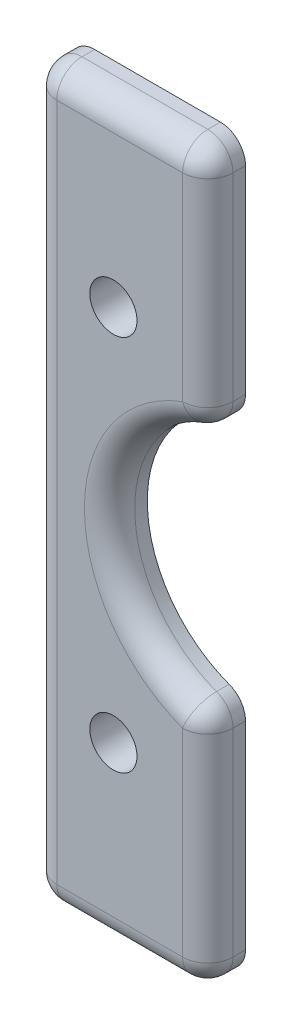
ISO-10303-21;
HEADER;
FILE_DESCRIPTION(('STEP AP214'),'2;1');
FILE_NAME('part.step','',(''),(''),'','','');
FILE_SCHEMA(('AUTOMOTIVE_DESIGN { 1 0 10303 214 1 1 1 1 }'));
ENDSEC;
DATA;
#1=APPLICATION_CONTEXT('core data for automotive mechanical design processes');
#2=APPLICATION_PROTOCOL_DEFINITION('international standard','automotive_design',2000,#1);
#3=PRODUCT_CONTEXT('',#1,'mechanical');
#4=PRODUCT('Part','Part','',(#3));
#5=PRODUCT_RELATED_PRODUCT_CATEGORY('part','',(#4));
#6=PRODUCT_DEFINITION_FORMATION('','',#4);
#7=PRODUCT_DEFINITION_CONTEXT('part definition',#1,'design');
#8=PRODUCT_DEFINITION('design','',#6,#7);
#9=PRODUCT_DEFINITION_SHAPE('','',#8);
#10=(LENGTH_UNIT() NAMED_UNIT(*) SI_UNIT(.MILLI.,.METRE.));
#11=(NAMED_UNIT(*) PLANE_ANGLE_UNIT() SI_UNIT($,.RADIAN.));
#12=(NAMED_UNIT(*) SI_UNIT($,.STERADIAN.) SOLID_ANGLE_UNIT());
#13=UNCERTAINTY_MEASURE_WITH_UNIT(LENGTH_MEASURE(1.E-05),#10,'distance_accuracy_value','');
#14=(GEOMETRIC_REPRESENTATION_CONTEXT(3) GLOBAL_UNCERTAINTY_ASSIGNED_CONTEXT((#13)) GLOBAL_UNIT_ASSIGNED_CONTEXT((#10,
#11,#12)) REPRESENTATION_CONTEXT('',''));
#15=CARTESIAN_POINT('',(0.,0.,0.));
#16=DIRECTION('',(0.,0.,1.));
#17=DIRECTION('',(1.,0.,0.));
#18=AXIS2_PLACEMENT_3D('',#15,#16,#17);
#19=CARTESIAN_POINT('',(-20.9977276506516,-57.0134412764199,3.));
#20=DIRECTION('',(0.,0.,1.));
#21=DIRECTION('',(1.,0.,0.));
#22=AXIS2_PLACEMENT_3D('',#19,#20,#21);
#23=PLANE('',#22);
#24=DIRECTION('',(0.,1.,0.));
#25=VECTOR('',#24,1.);
#26=CARTESIAN_POINT('',(-20.9977276506516,-41.2519748615297,3.));
#27=LINE('',#26,#25);
#28=CARTESIAN_POINT('',(-20.9977276506516,-57.0134412764199,3.));
#29=VERTEX_POINT('',#28);
#30=CARTESIAN_POINT('',(-20.9977276506516,-41.2519748615297,3.));
#31=VERTEX_POINT('',#30);
#32=EDGE_CURVE('E233',#29,#31,#27,.T.);
#33=ORIENTED_EDGE('',*,*,#32,.T.);
#34=CARTESIAN_POINT('',(-16.8042111934991,-30.0085581333471,3.));
#35=DIRECTION('',(0.,0.,1.));
#36=DIRECTION('',(1.,0.,0.));
#37=AXIS2_PLACEMENT_3D('',#34,#35,#36);
#38=CIRCLE('',#37,11.9999999999995);
#39=CARTESIAN_POINT('',(-20.9977276506516,-18.7651414051644,3.));
#40=VERTEX_POINT('',#39);
#41=EDGE_CURVE('E235',#31,#40,#38,.F.);
#42=ORIENTED_EDGE('',*,*,#41,.T.);
#43=DIRECTION('',(0.,1.,0.));
#44=VECTOR('',#43,1.);
#45=CARTESIAN_POINT('',(-20.9977276506516,-3.01344127641991,3.));
#46=LINE('',#45,#44);
#47=CARTESIAN_POINT('',(-20.9977276506516,-3.0134412764199,3.));
#48=VERTEX_POINT('',#47);
#49=EDGE_CURVE('E225',#40,#48,#46,.T.);
#50=ORIENTED_EDGE('',*,*,#49,.T.);
#51=DIRECTION('',(-1.,0.,0.));
#52=VECTOR('',#51,1.);
#53=CARTESIAN_POINT('',(-30.997581376349,-3.0134412764199,3.));
#54=LINE('',#53,#52);
#55=CARTESIAN_POINT('',(-30.997581376349,-3.0134412764199,3.));
#56=VERTEX_POINT('',#55);
#57=EDGE_CURVE('E227',#48,#56,#54,.T.);
#58=ORIENTED_EDGE('',*,*,#57,.T.);
#59=DIRECTION('',(0.,-1.,0.));
#60=VECTOR('',#59,1.);
#61=CARTESIAN_POINT('',(-30.997581376349,-57.0134412764199,3.));
#62=LINE('',#61,#60);
#63=CARTESIAN_POINT('',(-30.997581376349,-57.0134412764199,3.));
#64=VERTEX_POINT('',#63);
#65=EDGE_CURVE('E229',#56,#64,#62,.T.);
#66=ORIENTED_EDGE('',*,*,#65,.T.);
#67=DIRECTION('',(1.,0.,0.));
#68=VECTOR('',#67,1.);
#69=CARTESIAN_POINT('',(-20.9977276506516,-57.0134412764199,3.));
#70=LINE('',#69,#68);
#71=EDGE_CURVE('E231',#64,#29,#70,.T.);
#72=ORIENTED_EDGE('',*,*,#71,.T.);
#73=EDGE_LOOP('',(#33,#42,#50,#58,#66,#72));
#74=FACE_BOUND('',#73,.T.);
#75=CARTESIAN_POINT('',(-26.5018482558349,-15.0085587465849,3.));
#76=DIRECTION('',(0.,0.,1.));
#77=DIRECTION('',(1.,0.,0.));
#78=AXIS2_PLACEMENT_3D('',#75,#76,#77);
#79=CIRCLE('',#78,1.875);
#80=CARTESIAN_POINT('',(-24.6268482558349,-15.0085587465849,3.));
#81=VERTEX_POINT('',#80);
#82=EDGE_CURVE('E169',#81,#81,#79,.T.);
#83=ORIENTED_EDGE('',*,*,#82,.F.);
#84=EDGE_LOOP('',(#83));
#85=FACE_BOUND('',#84,.T.);
#86=CARTESIAN_POINT('',(-26.5018482558349,-45.0085587465849,3.));
#87=DIRECTION('',(0.,0.,1.));
#88=DIRECTION('',(1.,0.,0.));
#89=AXIS2_PLACEMENT_3D('',#86,#87,#88);
#90=CIRCLE('',#89,1.875);
#91=CARTESIAN_POINT('',(-24.6268482558349,-45.0085587465849,3.));
#92=VERTEX_POINT('',#91);
#93=EDGE_CURVE('E302',#92,#92,#90,.T.);
#94=ORIENTED_EDGE('',*,*,#93,.F.);
#95=EDGE_LOOP('',(#94));
#96=FACE_BOUND('',#95,.T.);
#97=ADVANCED_FACE('F33',(#74,#85,#96),#23,.T.);
#98=CARTESIAN_POINT('',(-20.9977276506516,-57.0134412764199,0.));
#99=DIRECTION('',(0.,0.,1.));
#100=DIRECTION('',(1.,0.,0.));
#101=AXIS2_PLACEMENT_3D('',#98,#99,#100);
#102=PLANE('',#101);
#103=CARTESIAN_POINT('',(-26.5018482557661,-52.5085587465851,0.));
#104=DIRECTION('',(0.,0.,1.));
#105=DIRECTION('',(1.,0.,0.));
#106=AXIS2_PLACEMENT_3D('',#103,#104,#105);
#107=CIRCLE('',#106,3.75000000000001);
#108=CARTESIAN_POINT('',(-22.7518482557661,-52.5085587465851,0.));
#109=VERTEX_POINT('',#108);
#110=EDGE_CURVE('E37',#109,#109,#107,.T.);
#111=ORIENTED_EDGE('',*,*,#110,.T.);
#112=EDGE_LOOP('',(#111));
#113=FACE_BOUND('',#112,.T.);
#114=CARTESIAN_POINT('',(-26.501848255766,-7.50855874658511,0.));
#115=DIRECTION('',(0.,0.,1.));
#116=DIRECTION('',(1.,0.,0.));
#117=AXIS2_PLACEMENT_3D('',#114,#115,#116);
#118=CIRCLE('',#117,3.75000000000001);
#119=CARTESIAN_POINT('',(-22.751848255766,-7.50855874658511,0.));
#120=VERTEX_POINT('',#119);
#121=EDGE_CURVE('E258',#120,#120,#118,.T.);
#122=ORIENTED_EDGE('',*,*,#121,.T.);
#123=EDGE_LOOP('',(#122));
#124=FACE_BOUND('',#123,.T.);
#125=CARTESIAN_POINT('',(-20.9977276506516,-57.0134412764199,0.));
#126=DIRECTION('',(0.,0.,1.));
#127=DIRECTION('',(1.,0.,0.));
#128=AXIS2_PLACEMENT_3D('',#125,#126,#127);
#129=CIRCLE('',#128,2.);
#130=CARTESIAN_POINT('',(-20.9977276506516,-59.0134412764199,0.));
#131=VERTEX_POINT('',#130);
#132=CARTESIAN_POINT('',(-18.9977276506516,-57.0134412764199,0.));
#133=VERTEX_POINT('',#132);
#134=EDGE_CURVE('E160',#131,#133,#129,.T.);
#135=ORIENTED_EDGE('',*,*,#134,.F.);
#136=DIRECTION('',(1.,0.,0.));
#137=VECTOR('',#136,1.);
#138=CARTESIAN_POINT('',(-20.9977276506516,-59.0134412764199,0.));
#139=LINE('',#138,#137);
#140=CARTESIAN_POINT('',(-30.997581376349,-59.0134412764199,0.));
#141=VERTEX_POINT('',#140);
#142=EDGE_CURVE('E201',#141,#131,#139,.T.);
#143=ORIENTED_EDGE('',*,*,#142,.F.);
#144=CARTESIAN_POINT('',(-30.997581376349,-57.0134412764199,0.));
#145=DIRECTION('',(0.,0.,1.));
#146=DIRECTION('',(-1.,0.,0.));
#147=AXIS2_PLACEMENT_3D('',#144,#145,#146);
#148=CIRCLE('',#147,2.);
#149=CARTESIAN_POINT('',(-32.997581376349,-57.0134412764199,0.));
#150=VERTEX_POINT('',#149);
#151=EDGE_CURVE('E198',#150,#141,#148,.T.);
#152=ORIENTED_EDGE('',*,*,#151,.F.);
#153=DIRECTION('',(0.,-1.,0.));
#154=VECTOR('',#153,1.);
#155=CARTESIAN_POINT('',(-32.997581376349,-3.01344127641992,0.));
#156=LINE('',#155,#154);
#157=CARTESIAN_POINT('',(-32.997581376349,-3.01344127641992,0.));
#158=VERTEX_POINT('',#157);
#159=EDGE_CURVE('E195',#158,#150,#156,.T.);
#160=ORIENTED_EDGE('',*,*,#159,.F.);
#161=CARTESIAN_POINT('',(-30.997581376349,-3.0134412764199,0.));
#162=DIRECTION('',(0.,0.,1.));
#163=DIRECTION('',(-1.,0.,0.));
#164=AXIS2_PLACEMENT_3D('',#161,#162,#163);
#165=CIRCLE('',#164,2.);
#166=CARTESIAN_POINT('',(-30.997581376349,-1.0134412764199,0.));
#167=VERTEX_POINT('',#166);
#168=EDGE_CURVE('E192',#167,#158,#165,.T.);
#169=ORIENTED_EDGE('',*,*,#168,.F.);
#170=DIRECTION('',(-1.,0.,0.));
#171=VECTOR('',#170,1.);
#172=CARTESIAN_POINT('',(-20.9977276506516,-1.0134412764199,0.));
#173=LINE('',#172,#171);
#174=CARTESIAN_POINT('',(-20.9977276506516,-1.0134412764199,0.));
#175=VERTEX_POINT('',#174);
#176=EDGE_CURVE('E189',#175,#167,#173,.T.);
#177=ORIENTED_EDGE('',*,*,#176,.F.);
#178=CARTESIAN_POINT('',(-20.9977276506516,-3.0134412764199,0.));
#179=DIRECTION('',(0.,0.,1.));
#180=DIRECTION('',(-1.,0.,0.));
#181=AXIS2_PLACEMENT_3D('',#178,#179,#180);
#182=CIRCLE('',#181,2.);
#183=CARTESIAN_POINT('',(-18.9977276506516,-3.01344127641991,0.));
#184=VERTEX_POINT('',#183);
#185=EDGE_CURVE('E186',#184,#175,#182,.T.);
#186=ORIENTED_EDGE('',*,*,#185,.F.);
#187=DIRECTION('',(0.,1.,0.));
#188=VECTOR('',#187,1.);
#189=CARTESIAN_POINT('',(-18.9977276506516,-3.01344127641992,0.));
#190=LINE('',#189,#188);
#191=CARTESIAN_POINT('',(-18.9977276506516,-18.7651414051644,0.));
#192=VERTEX_POINT('',#191);
#193=EDGE_CURVE('E183',#192,#184,#190,.T.);
#194=ORIENTED_EDGE('',*,*,#193,.F.);
#195=CARTESIAN_POINT('',(-20.9977276506516,-18.7651414051644,0.));
#196=DIRECTION('',(0.,0.,1.));
#197=DIRECTION('',(1.,0.,0.));
#198=AXIS2_PLACEMENT_3D('',#195,#196,#197);
#199=CIRCLE('',#198,2.);
#200=CARTESIAN_POINT('',(-20.2988082411262,-20.6390441931949,0.));
#201=VERTEX_POINT('',#200);
#202=EDGE_CURVE('E180',#201,#192,#199,.T.);
#203=ORIENTED_EDGE('',*,*,#202,.F.);
#204=CARTESIAN_POINT('',(-16.8042111934991,-30.0085581333471,0.));
#205=DIRECTION('',(0.,0.,-1.));
#206=DIRECTION('',(1.,0.,0.));
#207=AXIS2_PLACEMENT_3D('',#204,#205,#206);
#208=CIRCLE('',#207,9.99999999999946);
#209=CARTESIAN_POINT('',(-20.2988082411262,-39.3780720734992,0.));
#210=VERTEX_POINT('',#209);
#211=EDGE_CURVE('E177',#210,#201,#208,.T.);
#212=ORIENTED_EDGE('',*,*,#211,.F.);
#213=CARTESIAN_POINT('',(-20.9977276506516,-41.2519748615297,0.));
#214=DIRECTION('',(0.,0.,1.));
#215=DIRECTION('',(1.,0.,0.));
#216=AXIS2_PLACEMENT_3D('',#213,#214,#215);
#217=CIRCLE('',#216,2.);
#218=CARTESIAN_POINT('',(-18.9977276506516,-41.2519748615297,0.));
#219=VERTEX_POINT('',#218);
#220=EDGE_CURVE('E163',#219,#210,#217,.T.);
#221=ORIENTED_EDGE('',*,*,#220,.F.);
#222=DIRECTION('',(0.,1.,0.));
#223=VECTOR('',#222,1.);
#224=CARTESIAN_POINT('',(-18.9977276506516,-41.2519748615297,0.));
#225=LINE('',#224,#223);
#226=EDGE_CURVE('E145',#133,#219,#225,.T.);
#227=ORIENTED_EDGE('',*,*,#226,.F.);
#228=EDGE_LOOP('',(#135,#143,#152,#160,#169,#177,#186,#194,#203,#212,#221,#227));
#229=FACE_BOUND('',#228,.T.);
#230=CARTESIAN_POINT('',(-26.5018482558349,-15.0085587465849,0.));
#231=DIRECTION('',(0.,0.,1.));
#232=DIRECTION('',(1.,0.,0.));
#233=AXIS2_PLACEMENT_3D('',#230,#231,#232);
#234=CIRCLE('',#233,1.875);
#235=CARTESIAN_POINT('',(-24.6268482558349,-15.0085587465849,0.));
#236=VERTEX_POINT('',#235);
#237=EDGE_CURVE('E172',#236,#236,#234,.T.);
#238=ORIENTED_EDGE('',*,*,#237,.T.);
#239=EDGE_LOOP('',(#238));
#240=FACE_BOUND('',#239,.T.);
#241=CARTESIAN_POINT('',(-26.5018482558349,-45.0085587465849,0.));
#242=DIRECTION('',(0.,0.,1.));
#243=DIRECTION('',(1.,0.,0.));
#244=AXIS2_PLACEMENT_3D('',#241,#242,#243);
#245=CIRCLE('',#244,1.875);
#246=CARTESIAN_POINT('',(-24.6268482558349,-45.0085587465849,0.));
#247=VERTEX_POINT('',#246);
#248=EDGE_CURVE('E289',#247,#247,#245,.T.);
#249=ORIENTED_EDGE('',*,*,#248,.T.);
#250=EDGE_LOOP('',(#249));
#251=FACE_BOUND('',#250,.T.);
#252=ADVANCED_FACE('F157',(#113,#124,#229,#240,#251),#102,.F.);
#253=CARTESIAN_POINT('',(-20.9977276506516,-57.0134412764199,3.));
#254=DIRECTION('',(0.,0.,-1.));
#255=DIRECTION('',(-1.,0.,0.));
#256=AXIS2_PLACEMENT_3D('',#253,#254,#255);
#257=CYLINDRICAL_SURFACE('',#256,2.);
#258=DIRECTION('',(0.,0.,-1.));
#259=VECTOR('',#258,1.);
#260=CARTESIAN_POINT('',(-18.9977276506516,-57.0134412764199,3.));
#261=LINE('',#260,#259);
#262=CARTESIAN_POINT('',(-18.9977276506516,-57.0134412764199,1.));
#263=VERTEX_POINT('',#262);
#264=EDGE_CURVE('E141',#263,#133,#261,.T.);
#265=ORIENTED_EDGE('',*,*,#264,.F.);
#266=CARTESIAN_POINT('',(-20.9977276506516,-57.0134412764199,1.));
#267=DIRECTION('',(0.,0.,-1.));
#268=DIRECTION('',(-1.,0.,0.));
#269=AXIS2_PLACEMENT_3D('',#266,#267,#268);
#270=CIRCLE('',#269,2.);
#271=CARTESIAN_POINT('',(-20.9977276506516,-59.0134412764199,1.));
#272=VERTEX_POINT('',#271);
#273=EDGE_CURVE('E243',#263,#272,#270,.T.);
#274=ORIENTED_EDGE('',*,*,#273,.T.);
#275=DIRECTION('',(0.,0.,-1.));
#276=VECTOR('',#275,1.);
#277=CARTESIAN_POINT('',(-20.9977276506516,-59.0134412764199,3.));
#278=LINE('',#277,#276);
#279=EDGE_CURVE('E167',#272,#131,#278,.T.);
#280=ORIENTED_EDGE('',*,*,#279,.T.);
#281=ORIENTED_EDGE('',*,*,#134,.T.);
#282=EDGE_LOOP('',(#265,#274,#280,#281));
#283=FACE_BOUND('',#282,.T.);
#284=ADVANCED_FACE('F165',(#283),#257,.T.);
#285=CARTESIAN_POINT('',(-18.9977276506516,-41.2519748615297,3.));
#286=DIRECTION('',(-1.,0.,0.));
#287=DIRECTION('',(0.,0.,1.));
#288=AXIS2_PLACEMENT_3D('',#285,#286,#287);
#289=PLANE('',#288);
#290=DIRECTION('',(0.,0.,-1.));
#291=VECTOR('',#290,1.);
#292=CARTESIAN_POINT('',(-18.9977276506516,-41.2519748615297,3.));
#293=LINE('',#292,#291);
#294=CARTESIAN_POINT('',(-18.9977276506516,-41.2519748615297,1.));
#295=VERTEX_POINT('',#294);
#296=EDGE_CURVE('E153',#295,#219,#293,.T.);
#297=ORIENTED_EDGE('',*,*,#296,.F.);
#298=DIRECTION('',(0.,1.,0.));
#299=VECTOR('',#298,1.);
#300=CARTESIAN_POINT('',(-18.9977276506516,-57.0134412764199,1.));
#301=LINE('',#300,#299);
#302=EDGE_CURVE('E148',#295,#263,#301,.F.);
#303=ORIENTED_EDGE('',*,*,#302,.T.);
#304=ORIENTED_EDGE('',*,*,#264,.T.);
#305=ORIENTED_EDGE('',*,*,#226,.T.);
#306=EDGE_LOOP('',(#297,#303,#304,#305));
#307=FACE_BOUND('',#306,.T.);
#308=ADVANCED_FACE('F144',(#307),#289,.F.);
#309=CARTESIAN_POINT('',(-20.9977276506516,-41.2519748615297,3.));
#310=DIRECTION('',(0.,0.,-1.));
#311=DIRECTION('',(-1.,0.,0.));
#312=AXIS2_PLACEMENT_3D('',#309,#310,#311);
#313=CYLINDRICAL_SURFACE('',#312,2.);
#314=DIRECTION('',(0.,0.,-1.));
#315=VECTOR('',#314,1.);
#316=CARTESIAN_POINT('',(-20.2988082411262,-39.3780720734992,3.));
#317=LINE('',#316,#315);
#318=CARTESIAN_POINT('',(-20.2988082411262,-39.3780720734992,1.));
#319=VERTEX_POINT('',#318);
#320=EDGE_CURVE('E220',#319,#210,#317,.T.);
#321=ORIENTED_EDGE('',*,*,#320,.F.);
#322=CARTESIAN_POINT('',(-20.9977276506516,-41.2519748615297,1.));
#323=DIRECTION('',(0.,0.,-1.));
#324=DIRECTION('',(-1.,0.,0.));
#325=AXIS2_PLACEMENT_3D('',#322,#323,#324);
#326=CIRCLE('',#325,2.);
#327=EDGE_CURVE('E240',#319,#295,#326,.T.);
#328=ORIENTED_EDGE('',*,*,#327,.T.);
#329=ORIENTED_EDGE('',*,*,#296,.T.);
#330=ORIENTED_EDGE('',*,*,#220,.T.);
#331=EDGE_LOOP('',(#321,#328,#329,#330));
#332=FACE_BOUND('',#331,.T.);
#333=ADVANCED_FACE('F366',(#332),#313,.T.);
#334=CARTESIAN_POINT('',(-16.8042111934991,-30.0085581333471,3.));
#335=DIRECTION('',(0.,0.,-1.));
#336=DIRECTION('',(-1.,0.,0.));
#337=AXIS2_PLACEMENT_3D('',#334,#335,#336);
#338=CYLINDRICAL_SURFACE('',#337,9.99999999999946);
#339=DIRECTION('',(0.,0.,-1.));
#340=VECTOR('',#339,1.);
#341=CARTESIAN_POINT('',(-20.2988082411262,-20.6390441931949,3.));
#342=LINE('',#341,#340);
#343=CARTESIAN_POINT('',(-20.2988082411262,-20.6390441931949,1.));
#344=VERTEX_POINT('',#343);
#345=EDGE_CURVE('E218',#344,#201,#342,.T.);
#346=ORIENTED_EDGE('',*,*,#345,.F.);
#347=CARTESIAN_POINT('',(-16.8042111934991,-30.0085581333471,1.));
#348=DIRECTION('',(0.,0.,1.));
#349=DIRECTION('',(1.,0.,0.));
#350=AXIS2_PLACEMENT_3D('',#347,#348,#349);
#351=CIRCLE('',#350,9.99999999999946);
#352=EDGE_CURVE('E238',#344,#319,#351,.T.);
#353=ORIENTED_EDGE('',*,*,#352,.T.);
#354=ORIENTED_EDGE('',*,*,#320,.T.);
#355=ORIENTED_EDGE('',*,*,#211,.T.);
#356=EDGE_LOOP('',(#346,#353,#354,#355));
#357=FACE_BOUND('',#356,.T.);
#358=ADVANCED_FACE('F362',(#357),#338,.F.);
#359=CARTESIAN_POINT('',(-20.9977276506516,-18.7651414051644,3.));
#360=DIRECTION('',(0.,0.,-1.));
#361=DIRECTION('',(-1.,0.,0.));
#362=AXIS2_PLACEMENT_3D('',#359,#360,#361);
#363=CYLINDRICAL_SURFACE('',#362,2.);
#364=DIRECTION('',(0.,0.,-1.));
#365=VECTOR('',#364,1.);
#366=CARTESIAN_POINT('',(-18.9977276506516,-18.7651414051644,3.));
#367=LINE('',#366,#365);
#368=CARTESIAN_POINT('',(-18.9977276506516,-18.7651414051644,1.));
#369=VERTEX_POINT('',#368);
#370=EDGE_CURVE('E216',#369,#192,#367,.T.);
#371=ORIENTED_EDGE('',*,*,#370,.F.);
#372=CARTESIAN_POINT('',(-20.9977276506516,-18.7651414051644,1.));
#373=DIRECTION('',(0.,0.,-1.));
#374=DIRECTION('',(-1.,0.,0.));
#375=AXIS2_PLACEMENT_3D('',#372,#373,#374);
#376=CIRCLE('',#375,2.);
#377=EDGE_CURVE('E152',#369,#344,#376,.T.);
#378=ORIENTED_EDGE('',*,*,#377,.T.);
#379=ORIENTED_EDGE('',*,*,#345,.T.);
#380=ORIENTED_EDGE('',*,*,#202,.T.);
#381=EDGE_LOOP('',(#371,#378,#379,#380));
#382=FACE_BOUND('',#381,.T.);
#383=ADVANCED_FACE('F358',(#382),#363,.T.);
#384=CARTESIAN_POINT('',(-18.9977276506516,-3.01344127641992,3.));
#385=DIRECTION('',(-1.,0.,0.));
#386=DIRECTION('',(0.,0.,1.));
#387=AXIS2_PLACEMENT_3D('',#384,#385,#386);
#388=PLANE('',#387);
#389=DIRECTION('',(0.,0.,-1.));
#390=VECTOR('',#389,1.);
#391=CARTESIAN_POINT('',(-18.9977276506516,-3.01344127641991,3.));
#392=LINE('',#391,#390);
#393=CARTESIAN_POINT('',(-18.9977276506516,-3.01344127641991,1.));
#394=VERTEX_POINT('',#393);
#395=EDGE_CURVE('E214',#394,#184,#392,.T.);
#396=ORIENTED_EDGE('',*,*,#395,.F.);
#397=DIRECTION('',(0.,1.,0.));
#398=VECTOR('',#397,1.);
#399=CARTESIAN_POINT('',(-18.9977276506516,-18.7651414051644,1.));
#400=LINE('',#399,#398);
#401=EDGE_CURVE('E11',#394,#369,#400,.F.);
#402=ORIENTED_EDGE('',*,*,#401,.T.);
#403=ORIENTED_EDGE('',*,*,#370,.T.);
#404=ORIENTED_EDGE('',*,*,#193,.T.);
#405=EDGE_LOOP('',(#396,#402,#403,#404));
#406=FACE_BOUND('',#405,.T.);
#407=ADVANCED_FACE('F355',(#406),#388,.F.);
#408=CARTESIAN_POINT('',(-20.9977276506516,-3.0134412764199,3.));
#409=DIRECTION('',(0.,0.,-1.));
#410=DIRECTION('',(-1.,0.,0.));
#411=AXIS2_PLACEMENT_3D('',#408,#409,#410);
#412=CYLINDRICAL_SURFACE('',#411,2.);
#413=DIRECTION('',(0.,0.,-1.));
#414=VECTOR('',#413,1.);
#415=CARTESIAN_POINT('',(-20.9977276506516,-1.0134412764199,3.));
#416=LINE('',#415,#414);
#417=CARTESIAN_POINT('',(-20.9977276506516,-1.0134412764199,1.));
#418=VERTEX_POINT('',#417);
#419=EDGE_CURVE('E212',#418,#175,#416,.T.);
#420=ORIENTED_EDGE('',*,*,#419,.F.);
#421=CARTESIAN_POINT('',(-20.9977276506516,-3.0134412764199,1.));
#422=DIRECTION('',(0.,0.,-1.));
#423=DIRECTION('',(-1.,0.,0.));
#424=AXIS2_PLACEMENT_3D('',#421,#422,#423);
#425=CIRCLE('',#424,2.);
#426=EDGE_CURVE('E42',#418,#394,#425,.T.);
#427=ORIENTED_EDGE('',*,*,#426,.T.);
#428=ORIENTED_EDGE('',*,*,#395,.T.);
#429=ORIENTED_EDGE('',*,*,#185,.T.);
#430=EDGE_LOOP('',(#420,#427,#428,#429));
#431=FACE_BOUND('',#430,.T.);
#432=ADVANCED_FACE('F352',(#431),#412,.T.);
#433=CARTESIAN_POINT('',(-20.9977276506516,-1.0134412764199,3.));
#434=DIRECTION('',(0.,-1.,0.));
#435=DIRECTION('',(0.,0.,-1.));
#436=AXIS2_PLACEMENT_3D('',#433,#434,#435);
#437=PLANE('',#436);
#438=DIRECTION('',(0.,0.,-1.));
#439=VECTOR('',#438,1.);
#440=CARTESIAN_POINT('',(-30.997581376349,-1.0134412764199,3.));
#441=LINE('',#440,#439);
#442=CARTESIAN_POINT('',(-30.997581376349,-1.0134412764199,1.));
#443=VERTEX_POINT('',#442);
#444=EDGE_CURVE('E210',#443,#167,#441,.T.);
#445=ORIENTED_EDGE('',*,*,#444,.F.);
#446=DIRECTION('',(-1.,0.,0.));
#447=VECTOR('',#446,1.);
#448=CARTESIAN_POINT('',(-20.9977276506516,-1.0134412764199,1.));
#449=LINE('',#448,#447);
#450=EDGE_CURVE('E57',#443,#418,#449,.F.);
#451=ORIENTED_EDGE('',*,*,#450,.T.);
#452=ORIENTED_EDGE('',*,*,#419,.T.);
#453=ORIENTED_EDGE('',*,*,#176,.T.);
#454=EDGE_LOOP('',(#445,#451,#452,#453));
#455=FACE_BOUND('',#454,.T.);
#456=ADVANCED_FACE('F348',(#455),#437,.F.);
#457=CARTESIAN_POINT('',(-30.997581376349,-3.0134412764199,3.));
#458=DIRECTION('',(0.,0.,-1.));
#459=DIRECTION('',(-1.,0.,0.));
#460=AXIS2_PLACEMENT_3D('',#457,#458,#459);
#461=CYLINDRICAL_SURFACE('',#460,2.);
#462=DIRECTION('',(0.,0.,-1.));
#463=VECTOR('',#462,1.);
#464=CARTESIAN_POINT('',(-32.997581376349,-3.01344127641992,3.));
#465=LINE('',#464,#463);
#466=CARTESIAN_POINT('',(-32.997581376349,-3.01344127641992,1.));
#467=VERTEX_POINT('',#466);
#468=EDGE_CURVE('E208',#467,#158,#465,.T.);
#469=ORIENTED_EDGE('',*,*,#468,.F.);
#470=CARTESIAN_POINT('',(-30.997581376349,-3.0134412764199,1.));
#471=DIRECTION('',(0.,0.,-1.));
#472=DIRECTION('',(-1.,0.,0.));
#473=AXIS2_PLACEMENT_3D('',#470,#471,#472);
#474=CIRCLE('',#473,2.);
#475=EDGE_CURVE('E251',#467,#443,#474,.T.);
#476=ORIENTED_EDGE('',*,*,#475,.T.);
#477=ORIENTED_EDGE('',*,*,#444,.T.);
#478=ORIENTED_EDGE('',*,*,#168,.T.);
#479=EDGE_LOOP('',(#469,#476,#477,#478));
#480=FACE_BOUND('',#479,.T.);
#481=ADVANCED_FACE('F344',(#480),#461,.T.);
#482=CARTESIAN_POINT('',(-32.997581376349,-3.01344127641992,3.));
#483=DIRECTION('',(1.,0.,0.));
#484=DIRECTION('',(0.,0.,-1.));
#485=AXIS2_PLACEMENT_3D('',#482,#483,#484);
#486=PLANE('',#485);
#487=DIRECTION('',(0.,0.,-1.));
#488=VECTOR('',#487,1.);
#489=CARTESIAN_POINT('',(-32.997581376349,-57.0134412764199,3.));
#490=LINE('',#489,#488);
#491=CARTESIAN_POINT('',(-32.997581376349,-57.0134412764199,1.));
#492=VERTEX_POINT('',#491);
#493=EDGE_CURVE('E206',#492,#150,#490,.T.);
#494=ORIENTED_EDGE('',*,*,#493,.F.);
#495=DIRECTION('',(0.,-1.,0.));
#496=VECTOR('',#495,1.);
#497=CARTESIAN_POINT('',(-32.997581376349,-3.01344127641991,1.));
#498=LINE('',#497,#496);
#499=EDGE_CURVE('E249',#492,#467,#498,.F.);
#500=ORIENTED_EDGE('',*,*,#499,.T.);
#501=ORIENTED_EDGE('',*,*,#468,.T.);
#502=ORIENTED_EDGE('',*,*,#159,.T.);
#503=EDGE_LOOP('',(#494,#500,#501,#502));
#504=FACE_BOUND('',#503,.T.);
#505=ADVANCED_FACE('F340',(#504),#486,.F.);
#506=CARTESIAN_POINT('',(-30.997581376349,-57.0134412764199,3.));
#507=DIRECTION('',(0.,0.,-1.));
#508=DIRECTION('',(-1.,0.,0.));
#509=AXIS2_PLACEMENT_3D('',#506,#507,#508);
#510=CYLINDRICAL_SURFACE('',#509,2.);
#511=DIRECTION('',(0.,0.,-1.));
#512=VECTOR('',#511,1.);
#513=CARTESIAN_POINT('',(-30.997581376349,-59.0134412764199,3.));
#514=LINE('',#513,#512);
#515=CARTESIAN_POINT('',(-30.997581376349,-59.0134412764199,1.));
#516=VERTEX_POINT('',#515);
#517=EDGE_CURVE('E204',#516,#141,#514,.T.);
#518=ORIENTED_EDGE('',*,*,#517,.F.);
#519=CARTESIAN_POINT('',(-30.997581376349,-57.0134412764199,1.));
#520=DIRECTION('',(0.,0.,-1.));
#521=DIRECTION('',(-1.,0.,0.));
#522=AXIS2_PLACEMENT_3D('',#519,#520,#521);
#523=CIRCLE('',#522,2.);
#524=EDGE_CURVE('E247',#516,#492,#523,.T.);
#525=ORIENTED_EDGE('',*,*,#524,.T.);
#526=ORIENTED_EDGE('',*,*,#493,.T.);
#527=ORIENTED_EDGE('',*,*,#151,.T.);
#528=EDGE_LOOP('',(#518,#525,#526,#527));
#529=FACE_BOUND('',#528,.T.);
#530=ADVANCED_FACE('F336',(#529),#510,.T.);
#531=CARTESIAN_POINT('',(-20.9977276506516,-59.0134412764199,3.));
#532=DIRECTION('',(0.,1.,0.));
#533=DIRECTION('',(0.,0.,1.));
#534=AXIS2_PLACEMENT_3D('',#531,#532,#533);
#535=PLANE('',#534);
#536=ORIENTED_EDGE('',*,*,#279,.F.);
#537=DIRECTION('',(1.,0.,0.));
#538=VECTOR('',#537,1.);
#539=CARTESIAN_POINT('',(-30.997581376349,-59.0134412764199,1.));
#540=LINE('',#539,#538);
#541=EDGE_CURVE('E245',#272,#516,#540,.F.);
#542=ORIENTED_EDGE('',*,*,#541,.T.);
#543=ORIENTED_EDGE('',*,*,#517,.T.);
#544=ORIENTED_EDGE('',*,*,#142,.T.);
#545=EDGE_LOOP('',(#536,#542,#543,#544));
#546=FACE_BOUND('',#545,.T.);
#547=ADVANCED_FACE('F320',(#546),#535,.F.);
#548=CARTESIAN_POINT('',(-26.5018482558349,-15.0085587465849,3.));
#549=DIRECTION('',(0.,0.,-1.));
#550=DIRECTION('',(-1.,0.,0.));
#551=AXIS2_PLACEMENT_3D('',#548,#549,#550);
#552=CYLINDRICAL_SURFACE('',#551,1.875);
#553=ORIENTED_EDGE('',*,*,#82,.T.);
#554=EDGE_LOOP('',(#553));
#555=FACE_BOUND('',#554,.T.);
#556=ORIENTED_EDGE('',*,*,#237,.F.);
#557=EDGE_LOOP('',(#556));
#558=FACE_BOUND('',#557,.T.);
#559=ADVANCED_FACE('F311',(#555,#558),#552,.F.);
#560=CARTESIAN_POINT('',(-26.5018482558349,-45.0085587465849,3.));
#561=DIRECTION('',(0.,0.,-1.));
#562=DIRECTION('',(-1.,0.,0.));
#563=AXIS2_PLACEMENT_3D('',#560,#561,#562);
#564=CYLINDRICAL_SURFACE('',#563,1.875);
#565=ORIENTED_EDGE('',*,*,#93,.T.);
#566=EDGE_LOOP('',(#565));
#567=FACE_BOUND('',#566,.T.);
#568=ORIENTED_EDGE('',*,*,#248,.F.);
#569=EDGE_LOOP('',(#568));
#570=FACE_BOUND('',#569,.T.);
#571=ADVANCED_FACE('F309',(#567,#570),#564,.F.);
#572=CARTESIAN_POINT('',(-30.997581376349,-57.0134412764199,1.));
#573=DIRECTION('',(0.,0.,1.));
#574=DIRECTION('',(1.,0.,0.));
#575=AXIS2_PLACEMENT_3D('',#572,#573,#574);
#576=SPHERICAL_SURFACE('',#575,2.);
#577=CARTESIAN_POINT('',(-30.997581376349,-57.0134412764199,1.));
#578=DIRECTION('',(0.,1.,0.));
#579=DIRECTION('',(0.,0.,1.));
#580=AXIS2_PLACEMENT_3D('',#577,#578,#579);
#581=CIRCLE('',#580,2.);
#582=EDGE_CURVE('E284',#492,#64,#581,.T.);
#583=ORIENTED_EDGE('',*,*,#582,.F.);
#584=ORIENTED_EDGE('',*,*,#524,.F.);
#585=CARTESIAN_POINT('',(-30.997581376349,-57.0134412764199,1.));
#586=DIRECTION('',(1.,0.,0.));
#587=DIRECTION('',(0.,1.,0.));
#588=AXIS2_PLACEMENT_3D('',#585,#586,#587);
#589=CIRCLE('',#588,2.);
#590=EDGE_CURVE('E287',#64,#516,#589,.T.);
#591=ORIENTED_EDGE('',*,*,#590,.F.);
#592=EDGE_LOOP('',(#583,#584,#591));
#593=FACE_BOUND('',#592,.T.);
#594=ADVANCED_FACE('F35',(#593),#576,.T.);
#595=CARTESIAN_POINT('',(-20.9977276506516,-57.0134412764199,1.));
#596=DIRECTION('',(-1.,0.,0.));
#597=DIRECTION('',(0.,0.,1.));
#598=AXIS2_PLACEMENT_3D('',#595,#596,#597);
#599=CYLINDRICAL_SURFACE('',#598,2.);
#600=ORIENTED_EDGE('',*,*,#590,.T.);
#601=ORIENTED_EDGE('',*,*,#541,.F.);
#602=CARTESIAN_POINT('',(-20.9977276506516,-57.0134412764199,1.));
#603=DIRECTION('',(1.,0.,0.));
#604=DIRECTION('',(0.,1.,0.));
#605=AXIS2_PLACEMENT_3D('',#602,#603,#604);
#606=CIRCLE('',#605,2.);
#607=EDGE_CURVE('E281',#29,#272,#606,.T.);
#608=ORIENTED_EDGE('',*,*,#607,.F.);
#609=ORIENTED_EDGE('',*,*,#71,.F.);
#610=EDGE_LOOP('',(#600,#601,#608,#609));
#611=FACE_BOUND('',#610,.T.);
#612=ADVANCED_FACE('F318',(#611),#599,.T.);
#613=CARTESIAN_POINT('',(-30.997581376349,-57.0134412764199,1.));
#614=DIRECTION('',(0.,1.,0.));
#615=DIRECTION('',(0.,0.,1.));
#616=AXIS2_PLACEMENT_3D('',#613,#614,#615);
#617=CYLINDRICAL_SURFACE('',#616,2.);
#618=ORIENTED_EDGE('',*,*,#582,.T.);
#619=ORIENTED_EDGE('',*,*,#65,.F.);
#620=CARTESIAN_POINT('',(-30.997581376349,-3.01344127641992,1.));
#621=DIRECTION('',(0.,1.,0.));
#622=DIRECTION('',(0.,0.,1.));
#623=AXIS2_PLACEMENT_3D('',#620,#621,#622);
#624=CIRCLE('',#623,2.);
#625=EDGE_CURVE('E278',#467,#56,#624,.T.);
#626=ORIENTED_EDGE('',*,*,#625,.F.);
#627=ORIENTED_EDGE('',*,*,#499,.F.);
#628=EDGE_LOOP('',(#618,#619,#626,#627));
#629=FACE_BOUND('',#628,.T.);
#630=ADVANCED_FACE('F411',(#629),#617,.T.);
#631=CARTESIAN_POINT('',(-20.9977276506516,-57.0134412764199,1.));
#632=DIRECTION('',(0.,0.,1.));
#633=DIRECTION('',(1.,0.,0.));
#634=AXIS2_PLACEMENT_3D('',#631,#632,#633);
#635=SPHERICAL_SURFACE('',#634,2.);
#636=ORIENTED_EDGE('',*,*,#607,.T.);
#637=ORIENTED_EDGE('',*,*,#273,.F.);
#638=CARTESIAN_POINT('',(-20.9977276506516,-57.0134412764199,1.));
#639=DIRECTION('',(0.,1.,0.));
#640=DIRECTION('',(-1.,0.,0.));
#641=AXIS2_PLACEMENT_3D('',#638,#639,#640);
#642=CIRCLE('',#641,2.);
#643=EDGE_CURVE('E275',#29,#263,#642,.T.);
#644=ORIENTED_EDGE('',*,*,#643,.F.);
#645=EDGE_LOOP('',(#636,#637,#644));
#646=FACE_BOUND('',#645,.T.);
#647=ADVANCED_FACE('F407',(#646),#635,.T.);
#648=CARTESIAN_POINT('',(-30.997581376349,-3.0134412764199,1.));
#649=DIRECTION('',(0.,0.,1.));
#650=DIRECTION('',(1.,0.,0.));
#651=AXIS2_PLACEMENT_3D('',#648,#649,#650);
#652=SPHERICAL_SURFACE('',#651,2.);
#653=ORIENTED_EDGE('',*,*,#475,.F.);
#654=ORIENTED_EDGE('',*,*,#625,.T.);
#655=CARTESIAN_POINT('',(-30.997581376349,-3.0134412764199,1.));
#656=DIRECTION('',(1.,0.,0.));
#657=DIRECTION('',(0.,1.,0.));
#658=AXIS2_PLACEMENT_3D('',#655,#656,#657);
#659=CIRCLE('',#658,2.);
#660=EDGE_CURVE('E272',#443,#56,#659,.T.);
#661=ORIENTED_EDGE('',*,*,#660,.F.);
#662=EDGE_LOOP('',(#653,#654,#661));
#663=FACE_BOUND('',#662,.T.);
#664=ADVANCED_FACE('F403',(#663),#652,.T.);
#665=CARTESIAN_POINT('',(-20.9977276506516,-57.0134412764199,1.));
#666=DIRECTION('',(0.,-1.,0.));
#667=DIRECTION('',(0.,0.,-1.));
#668=AXIS2_PLACEMENT_3D('',#665,#666,#667);
#669=CYLINDRICAL_SURFACE('',#668,2.);
#670=ORIENTED_EDGE('',*,*,#643,.T.);
#671=ORIENTED_EDGE('',*,*,#302,.F.);
#672=CARTESIAN_POINT('',(-20.9977276506516,-41.2519748615297,1.));
#673=DIRECTION('',(0.,1.,0.));
#674=DIRECTION('',(0.,0.,1.));
#675=AXIS2_PLACEMENT_3D('',#672,#673,#674);
#676=CIRCLE('',#675,2.);
#677=EDGE_CURVE('E269',#31,#295,#676,.T.);
#678=ORIENTED_EDGE('',*,*,#677,.F.);
#679=ORIENTED_EDGE('',*,*,#32,.F.);
#680=EDGE_LOOP('',(#670,#671,#678,#679));
#681=FACE_BOUND('',#680,.T.);
#682=ADVANCED_FACE('F399',(#681),#669,.T.);
#683=CARTESIAN_POINT('',(-20.9977276506516,-3.0134412764199,1.));
#684=DIRECTION('',(1.,0.,0.));
#685=DIRECTION('',(0.,0.,-1.));
#686=AXIS2_PLACEMENT_3D('',#683,#684,#685);
#687=CYLINDRICAL_SURFACE('',#686,2.);
#688=ORIENTED_EDGE('',*,*,#660,.T.);
#689=ORIENTED_EDGE('',*,*,#57,.F.);
#690=CARTESIAN_POINT('',(-20.9977276506516,-3.0134412764199,1.));
#691=DIRECTION('',(1.,0.,0.));
#692=DIRECTION('',(0.,0.,-1.));
#693=AXIS2_PLACEMENT_3D('',#690,#691,#692);
#694=CIRCLE('',#693,2.);
#695=EDGE_CURVE('E266',#418,#48,#694,.T.);
#696=ORIENTED_EDGE('',*,*,#695,.F.);
#697=ORIENTED_EDGE('',*,*,#450,.F.);
#698=EDGE_LOOP('',(#688,#689,#696,#697));
#699=FACE_BOUND('',#698,.T.);
#700=ADVANCED_FACE('F395',(#699),#687,.T.);
#701=CARTESIAN_POINT('',(-20.9977276506516,-41.2519748615297,1.));
#702=DIRECTION('',(0.,0.,1.));
#703=DIRECTION('',(1.,0.,0.));
#704=AXIS2_PLACEMENT_3D('',#701,#702,#703);
#705=SPHERICAL_SURFACE('',#704,2.);
#706=ORIENTED_EDGE('',*,*,#677,.T.);
#707=ORIENTED_EDGE('',*,*,#327,.F.);
#708=CARTESIAN_POINT('',(-20.9977276506516,-41.2519748615297,1.));
#709=DIRECTION('',(-0.936951394015264,0.349459704762728,0.));
#710=DIRECTION('',(-0.349459704762728,-0.936951394015264,0.));
#711=AXIS2_PLACEMENT_3D('',#708,#709,#710);
#712=CIRCLE('',#711,2.);
#713=EDGE_CURVE('E263',#31,#319,#712,.T.);
#714=ORIENTED_EDGE('',*,*,#713,.F.);
#715=EDGE_LOOP('',(#706,#707,#714));
#716=FACE_BOUND('',#715,.T.);
#717=ADVANCED_FACE('F391',(#716),#705,.T.);
#718=CARTESIAN_POINT('',(-20.9977276506516,-3.0134412764199,1.));
#719=DIRECTION('',(0.,0.,1.));
#720=DIRECTION('',(1.,0.,0.));
#721=AXIS2_PLACEMENT_3D('',#718,#719,#720);
#722=SPHERICAL_SURFACE('',#721,2.);
#723=ORIENTED_EDGE('',*,*,#426,.F.);
#724=ORIENTED_EDGE('',*,*,#695,.T.);
#725=CARTESIAN_POINT('',(-20.9977276506516,-3.0134412764199,1.));
#726=DIRECTION('',(0.,-1.,0.));
#727=DIRECTION('',(1.,0.,0.));
#728=AXIS2_PLACEMENT_3D('',#725,#726,#727);
#729=CIRCLE('',#728,2.);
#730=EDGE_CURVE('E260',#394,#48,#729,.T.);
#731=ORIENTED_EDGE('',*,*,#730,.F.);
#732=EDGE_LOOP('',(#723,#724,#731));
#733=FACE_BOUND('',#732,.T.);
#734=ADVANCED_FACE('F387',(#733),#722,.T.);
#735=CARTESIAN_POINT('',(-16.8042111934991,-30.0085581333471,1.));
#736=DIRECTION('',(0.,0.,1.));
#737=DIRECTION('',(1.,0.,0.));
#738=AXIS2_PLACEMENT_3D('',#735,#736,#737);
#739=TOROIDAL_SURFACE('',#738,11.9999999999995,2.);
#740=ORIENTED_EDGE('',*,*,#713,.T.);
#741=ORIENTED_EDGE('',*,*,#352,.F.);
#742=CARTESIAN_POINT('',(-20.9977276506516,-18.7651414051644,1.));
#743=DIRECTION('',(0.936951394015265,0.349459704762727,0.));
#744=DIRECTION('',(-0.349459704762727,0.936951394015265,0.));
#745=AXIS2_PLACEMENT_3D('',#742,#743,#744);
#746=CIRCLE('',#745,2.);
#747=EDGE_CURVE('E257',#40,#344,#746,.T.);
#748=ORIENTED_EDGE('',*,*,#747,.F.);
#749=ORIENTED_EDGE('',*,*,#41,.F.);
#750=EDGE_LOOP('',(#740,#741,#748,#749));
#751=FACE_BOUND('',#750,.T.);
#752=ADVANCED_FACE('F383',(#751),#739,.T.);
#753=CARTESIAN_POINT('',(-20.9977276506516,-57.0134412764199,1.));
#754=DIRECTION('',(0.,-1.,0.));
#755=DIRECTION('',(0.,0.,-1.));
#756=AXIS2_PLACEMENT_3D('',#753,#754,#755);
#757=CYLINDRICAL_SURFACE('',#756,2.);
#758=ORIENTED_EDGE('',*,*,#730,.T.);
#759=ORIENTED_EDGE('',*,*,#49,.F.);
#760=CARTESIAN_POINT('',(-20.9977276506516,-18.7651414051644,1.));
#761=DIRECTION('',(0.,-1.,0.));
#762=DIRECTION('',(0.,0.,-1.));
#763=AXIS2_PLACEMENT_3D('',#760,#761,#762);
#764=CIRCLE('',#763,2.);
#765=EDGE_CURVE('E255',#369,#40,#764,.T.);
#766=ORIENTED_EDGE('',*,*,#765,.F.);
#767=ORIENTED_EDGE('',*,*,#401,.F.);
#768=EDGE_LOOP('',(#758,#759,#766,#767));
#769=FACE_BOUND('',#768,.T.);
#770=ADVANCED_FACE('F379',(#769),#757,.T.);
#771=CARTESIAN_POINT('',(-20.9977276506516,-18.7651414051644,1.));
#772=DIRECTION('',(0.,0.,1.));
#773=DIRECTION('',(1.,0.,0.));
#774=AXIS2_PLACEMENT_3D('',#771,#772,#773);
#775=SPHERICAL_SURFACE('',#774,2.);
#776=ORIENTED_EDGE('',*,*,#747,.T.);
#777=ORIENTED_EDGE('',*,*,#377,.F.);
#778=ORIENTED_EDGE('',*,*,#765,.T.);
#779=EDGE_LOOP('',(#776,#777,#778));
#780=FACE_BOUND('',#779,.T.);
#781=ADVANCED_FACE('F375',(#780),#775,.T.);
#782=CARTESIAN_POINT('',(-26.501848255766,-7.50855874658511,-1.));
#783=DIRECTION('',(0.,0.,1.));
#784=DIRECTION('',(1.,0.,0.));
#785=AXIS2_PLACEMENT_3D('',#782,#783,#784);
#786=CYLINDRICAL_SURFACE('',#785,3.75000000000001);
#787=CARTESIAN_POINT('',(-26.501848255766,-7.50855874658511,-1.));
#788=DIRECTION('',(0.,0.,1.));
#789=DIRECTION('',(1.,0.,0.));
#790=AXIS2_PLACEMENT_3D('',#787,#788,#789);
#791=CIRCLE('',#790,3.75000000000001);
#792=CARTESIAN_POINT('',(-22.751848255766,-7.50855874658511,-1.));
#793=VERTEX_POINT('',#792);
#794=EDGE_CURVE('E291',#793,#793,#791,.T.);
#795=ORIENTED_EDGE('',*,*,#794,.T.);
#796=EDGE_LOOP('',(#795));
#797=FACE_BOUND('',#796,.T.);
#798=ORIENTED_EDGE('',*,*,#121,.F.);
#799=EDGE_LOOP('',(#798));
#800=FACE_BOUND('',#799,.T.);
#801=ADVANCED_FACE('F378',(#797,#800),#786,.T.);
#802=CARTESIAN_POINT('',(-26.501848255766,-7.50855874658511,-1.));
#803=DIRECTION('',(0.,0.,1.));
#804=DIRECTION('',(1.,0.,0.));
#805=AXIS2_PLACEMENT_3D('',#802,#803,#804);
#806=PLANE('',#805);
#807=ORIENTED_EDGE('',*,*,#794,.F.);
#808=EDGE_LOOP('',(#807));
#809=FACE_BOUND('',#808,.T.);
#810=ADVANCED_FACE('F506',(#809),#806,.F.);
#811=CARTESIAN_POINT('',(-26.5018482557661,-52.5085587465851,-1.));
#812=DIRECTION('',(0.,0.,1.));
#813=DIRECTION('',(1.,0.,0.));
#814=AXIS2_PLACEMENT_3D('',#811,#812,#813);
#815=CYLINDRICAL_SURFACE('',#814,3.75000000000001);
#816=CARTESIAN_POINT('',(-26.5018482557661,-52.5085587465851,-1.));
#817=DIRECTION('',(0.,0.,1.));
#818=DIRECTION('',(1.,0.,0.));
#819=AXIS2_PLACEMENT_3D('',#816,#817,#818);
#820=CIRCLE('',#819,3.75000000000001);
#821=CARTESIAN_POINT('',(-22.7518482557661,-52.5085587465851,-1.));
#822=VERTEX_POINT('',#821);
#823=EDGE_CURVE('E299',#822,#822,#820,.T.);
#824=ORIENTED_EDGE('',*,*,#823,.T.);
#825=EDGE_LOOP('',(#824));
#826=FACE_BOUND('',#825,.T.);
#827=ORIENTED_EDGE('',*,*,#110,.F.);
#828=EDGE_LOOP('',(#827));
#829=FACE_BOUND('',#828,.T.);
#830=ADVANCED_FACE('F513',(#826,#829),#815,.T.);
#831=CARTESIAN_POINT('',(-26.5018482557661,-52.5085587465851,-1.));
#832=DIRECTION('',(0.,0.,1.));
#833=DIRECTION('',(1.,0.,0.));
#834=AXIS2_PLACEMENT_3D('',#831,#832,#833);
#835=PLANE('',#834);
#836=ORIENTED_EDGE('',*,*,#823,.F.);
#837=EDGE_LOOP('',(#836));
#838=FACE_BOUND('',#837,.T.);
#839=ADVANCED_FACE('F521',(#838),#835,.F.);
#840=CLOSED_SHELL('',(#97,#252,#284,#308,#333,#358,#383,#407,#432,#456,#481,#505,#530,#547,#559,
#571,#594,#612,#630,#647,#664,#682,#700,#717,#734,#752,#770,#781,#801,#810,#830,#839));
#841=MANIFOLD_SOLID_BREP('B2',#840);
#842=ADVANCED_BREP_SHAPE_REPRESENTATION('',(#18,#841),#14);
#843=SHAPE_DEFINITION_REPRESENTATION(#9,#842);
ENDSEC;
END-ISO-10303-21;
